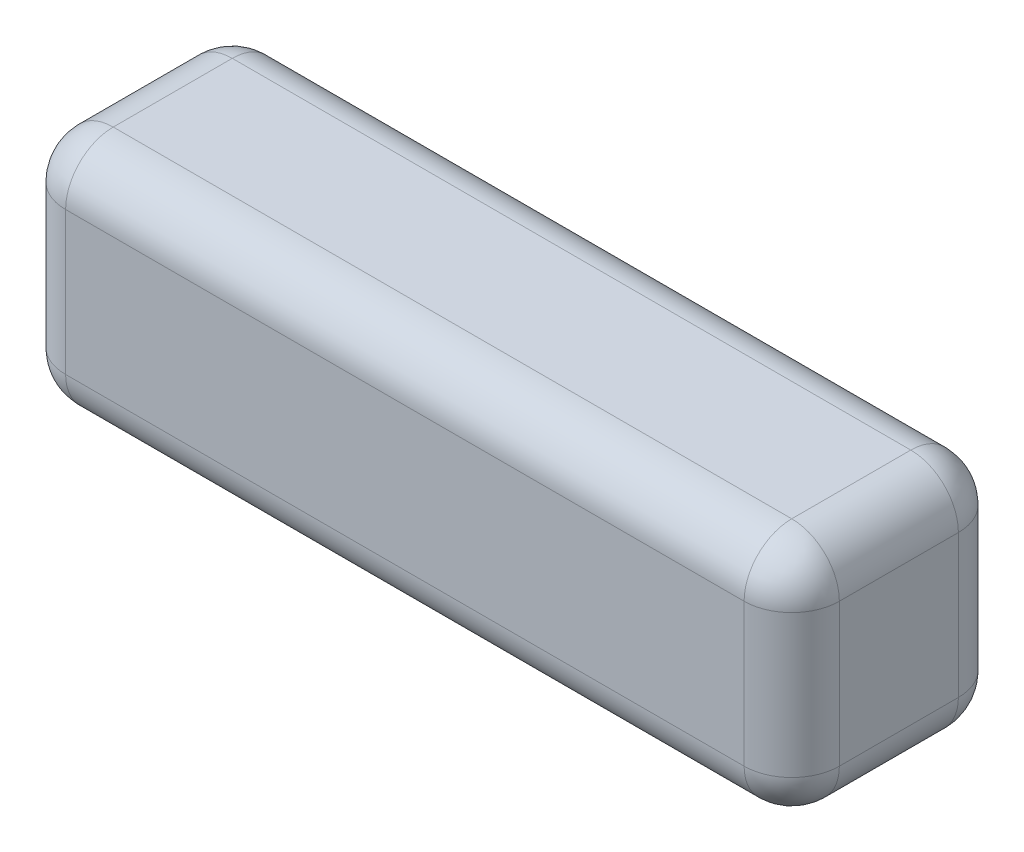
ISO-10303-21;
HEADER;
FILE_DESCRIPTION(('STEP AP214'),'2;1');
FILE_NAME('part.step','',(''),(''),'','','');
FILE_SCHEMA(('AUTOMOTIVE_DESIGN { 1 0 10303 214 1 1 1 1 }'));
ENDSEC;
DATA;
#1=APPLICATION_CONTEXT('core data for automotive mechanical design processes');
#2=APPLICATION_PROTOCOL_DEFINITION('international standard','automotive_design',2000,#1);
#3=PRODUCT_CONTEXT('',#1,'mechanical');
#4=PRODUCT('Part','Part','',(#3));
#5=PRODUCT_RELATED_PRODUCT_CATEGORY('part','',(#4));
#6=PRODUCT_DEFINITION_FORMATION('','',#4);
#7=PRODUCT_DEFINITION_CONTEXT('part definition',#1,'design');
#8=PRODUCT_DEFINITION('design','',#6,#7);
#9=PRODUCT_DEFINITION_SHAPE('','',#8);
#10=(LENGTH_UNIT() NAMED_UNIT(*) SI_UNIT(.MILLI.,.METRE.));
#11=(NAMED_UNIT(*) PLANE_ANGLE_UNIT() SI_UNIT($,.RADIAN.));
#12=(NAMED_UNIT(*) SI_UNIT($,.STERADIAN.) SOLID_ANGLE_UNIT());
#13=UNCERTAINTY_MEASURE_WITH_UNIT(LENGTH_MEASURE(1.E-05),#10,'distance_accuracy_value','');
#14=(GEOMETRIC_REPRESENTATION_CONTEXT(3) GLOBAL_UNCERTAINTY_ASSIGNED_CONTEXT((#13)) GLOBAL_UNIT_ASSIGNED_CONTEXT((#10,
#11,#12)) REPRESENTATION_CONTEXT('',''));
#15=CARTESIAN_POINT('',(0.,0.,0.));
#16=DIRECTION('',(0.,0.,1.));
#17=DIRECTION('',(1.,0.,0.));
#18=AXIS2_PLACEMENT_3D('',#15,#16,#17);
#19=CARTESIAN_POINT('',(28.5,-24.,113.));
#20=DIRECTION('',(0.,-1.,0.));
#21=DIRECTION('',(1.,0.,0.));
#22=AXIS2_PLACEMENT_3D('',#19,#20,#21);
#23=SPHERICAL_SURFACE('',#22,4.);
#24=CARTESIAN_POINT('',(28.5,-24.,113.));
#25=DIRECTION('',(0.,0.,-1.));
#26=DIRECTION('',(1.,0.,0.));
#27=AXIS2_PLACEMENT_3D('',#24,#25,#26);
#28=CIRCLE('',#27,4.);
#29=CARTESIAN_POINT('',(28.5,-20.,113.));
#30=VERTEX_POINT('',#29);
#31=CARTESIAN_POINT('',(32.5,-24.,113.));
#32=VERTEX_POINT('',#31);
#33=EDGE_CURVE('E10',#30,#32,#28,.T.);
#34=ORIENTED_EDGE('',*,*,#33,.F.);
#35=CARTESIAN_POINT('',(28.5,-24.,113.));
#36=DIRECTION('',(1.,0.,0.));
#37=DIRECTION('',(0.,0.,1.));
#38=AXIS2_PLACEMENT_3D('',#35,#36,#37);
#39=CIRCLE('',#38,4.);
#40=CARTESIAN_POINT('',(28.5,-24.,117.));
#41=VERTEX_POINT('',#40);
#42=EDGE_CURVE('E255',#30,#41,#39,.T.);
#43=ORIENTED_EDGE('',*,*,#42,.T.);
#44=CARTESIAN_POINT('',(28.5,-24.,113.));
#45=DIRECTION('',(0.,-1.,0.));
#46=DIRECTION('',(1.,0.,0.));
#47=AXIS2_PLACEMENT_3D('',#44,#45,#46);
#48=CIRCLE('',#47,4.);
#49=EDGE_CURVE('E300',#32,#41,#48,.T.);
#50=ORIENTED_EDGE('',*,*,#49,.F.);
#51=EDGE_LOOP('',(#34,#43,#50));
#52=FACE_BOUND('',#51,.T.);
#53=ADVANCED_FACE('F16',(#52),#23,.T.);
#54=CARTESIAN_POINT('',(28.5,-24.,103.));
#55=DIRECTION('',(0.,0.,1.));
#56=DIRECTION('',(1.,0.,0.));
#57=AXIS2_PLACEMENT_3D('',#54,#55,#56);
#58=SPHERICAL_SURFACE('',#57,4.);
#59=CARTESIAN_POINT('',(28.5,-24.,103.));
#60=DIRECTION('',(0.,-1.,0.));
#61=DIRECTION('',(1.,0.,0.));
#62=AXIS2_PLACEMENT_3D('',#59,#60,#61);
#63=CIRCLE('',#62,4.);
#64=CARTESIAN_POINT('',(28.5,-24.,99.));
#65=VERTEX_POINT('',#64);
#66=CARTESIAN_POINT('',(32.5,-24.,103.));
#67=VERTEX_POINT('',#66);
#68=EDGE_CURVE('E235',#65,#67,#63,.T.);
#69=ORIENTED_EDGE('',*,*,#68,.F.);
#70=CARTESIAN_POINT('',(28.5,-24.,103.));
#71=DIRECTION('',(1.,0.,0.));
#72=DIRECTION('',(0.,1.,0.));
#73=AXIS2_PLACEMENT_3D('',#70,#71,#72);
#74=CIRCLE('',#73,4.);
#75=CARTESIAN_POINT('',(28.5,-20.,103.));
#76=VERTEX_POINT('',#75);
#77=EDGE_CURVE('E236',#65,#76,#74,.T.);
#78=ORIENTED_EDGE('',*,*,#77,.T.);
#79=CARTESIAN_POINT('',(28.5,-24.,103.));
#80=DIRECTION('',(0.,0.,1.));
#81=DIRECTION('',(1.,0.,0.));
#82=AXIS2_PLACEMENT_3D('',#79,#80,#81);
#83=CIRCLE('',#82,4.);
#84=EDGE_CURVE('E25',#67,#76,#83,.T.);
#85=ORIENTED_EDGE('',*,*,#84,.F.);
#86=EDGE_LOOP('',(#69,#78,#85));
#87=FACE_BOUND('',#86,.T.);
#88=ADVANCED_FACE('F385',(#87),#58,.T.);
#89=CARTESIAN_POINT('',(32.5,-40.,99.));
#90=DIRECTION('',(1.,0.,0.));
#91=DIRECTION('',(0.,1.,0.));
#92=AXIS2_PLACEMENT_3D('',#89,#90,#91);
#93=PLANE('',#92);
#94=DIRECTION('',(0.,0.,1.));
#95=VECTOR('',#94,1.);
#96=CARTESIAN_POINT('',(32.5,-36.,99.));
#97=LINE('',#96,#95);
#98=CARTESIAN_POINT('',(32.5,-36.,103.));
#99=VERTEX_POINT('',#98);
#100=CARTESIAN_POINT('',(32.5,-36.,113.));
#101=VERTEX_POINT('',#100);
#102=EDGE_CURVE('E258',#99,#101,#97,.T.);
#103=ORIENTED_EDGE('',*,*,#102,.F.);
#104=DIRECTION('',(0.,1.,0.));
#105=VECTOR('',#104,1.);
#106=CARTESIAN_POINT('',(32.5,-40.,103.));
#107=LINE('',#106,#105);
#108=EDGE_CURVE('E251',#99,#67,#107,.T.);
#109=ORIENTED_EDGE('',*,*,#108,.T.);
#110=DIRECTION('',(0.,0.,1.));
#111=VECTOR('',#110,1.);
#112=CARTESIAN_POINT('',(32.5,-24.,99.));
#113=LINE('',#112,#111);
#114=EDGE_CURVE('E223',#67,#32,#113,.T.);
#115=ORIENTED_EDGE('',*,*,#114,.T.);
#116=DIRECTION('',(0.,1.,0.));
#117=VECTOR('',#116,1.);
#118=CARTESIAN_POINT('',(32.5,-40.,113.));
#119=LINE('',#118,#117);
#120=EDGE_CURVE('E298',#101,#32,#119,.T.);
#121=ORIENTED_EDGE('',*,*,#120,.F.);
#122=EDGE_LOOP('',(#103,#109,#115,#121));
#123=FACE_BOUND('',#122,.T.);
#124=ADVANCED_FACE('F358',(#123),#93,.T.);
#125=CARTESIAN_POINT('',(28.5,-36.,113.));
#126=DIRECTION('',(0.,0.,-1.));
#127=DIRECTION('',(1.,0.,0.));
#128=AXIS2_PLACEMENT_3D('',#125,#126,#127);
#129=SPHERICAL_SURFACE('',#128,4.);
#130=CARTESIAN_POINT('',(28.5,-36.,113.));
#131=DIRECTION('',(0.,1.,0.));
#132=DIRECTION('',(1.,0.,0.));
#133=AXIS2_PLACEMENT_3D('',#130,#131,#132);
#134=CIRCLE('',#133,4.);
#135=CARTESIAN_POINT('',(28.5,-36.,117.));
#136=VERTEX_POINT('',#135);
#137=EDGE_CURVE('E273',#136,#101,#134,.T.);
#138=ORIENTED_EDGE('',*,*,#137,.F.);
#139=CARTESIAN_POINT('',(28.5,-36.,113.));
#140=DIRECTION('',(1.,0.,0.));
#141=DIRECTION('',(0.,-1.,0.));
#142=AXIS2_PLACEMENT_3D('',#139,#140,#141);
#143=CIRCLE('',#142,4.);
#144=CARTESIAN_POINT('',(28.5,-40.,113.));
#145=VERTEX_POINT('',#144);
#146=EDGE_CURVE('E141',#136,#145,#143,.T.);
#147=ORIENTED_EDGE('',*,*,#146,.T.);
#148=CARTESIAN_POINT('',(28.5,-36.,113.));
#149=DIRECTION('',(0.,0.,-1.));
#150=DIRECTION('',(1.,0.,0.));
#151=AXIS2_PLACEMENT_3D('',#148,#149,#150);
#152=CIRCLE('',#151,4.);
#153=EDGE_CURVE('E274',#101,#145,#152,.T.);
#154=ORIENTED_EDGE('',*,*,#153,.F.);
#155=EDGE_LOOP('',(#138,#147,#154));
#156=FACE_BOUND('',#155,.T.);
#157=ADVANCED_FACE('F355',(#156),#129,.T.);
#158=CARTESIAN_POINT('',(28.5,-36.,103.));
#159=DIRECTION('',(0.,0.,1.));
#160=DIRECTION('',(1.,0.,0.));
#161=AXIS2_PLACEMENT_3D('',#158,#159,#160);
#162=SPHERICAL_SURFACE('',#161,4.);
#163=CARTESIAN_POINT('',(28.5,-36.,103.));
#164=DIRECTION('',(0.,0.,-1.));
#165=DIRECTION('',(1.,0.,0.));
#166=AXIS2_PLACEMENT_3D('',#163,#164,#165);
#167=CIRCLE('',#166,4.);
#168=CARTESIAN_POINT('',(28.5,-40.,103.));
#169=VERTEX_POINT('',#168);
#170=EDGE_CURVE('E277',#99,#169,#167,.T.);
#171=ORIENTED_EDGE('',*,*,#170,.T.);
#172=CARTESIAN_POINT('',(28.5,-36.,103.));
#173=DIRECTION('',(-1.,0.,0.));
#174=DIRECTION('',(0.,-1.,0.));
#175=AXIS2_PLACEMENT_3D('',#172,#173,#174);
#176=CIRCLE('',#175,4.);
#177=CARTESIAN_POINT('',(28.5,-36.,99.));
#178=VERTEX_POINT('',#177);
#179=EDGE_CURVE('E281',#178,#169,#176,.T.);
#180=ORIENTED_EDGE('',*,*,#179,.F.);
#181=CARTESIAN_POINT('',(28.5,-36.,103.));
#182=DIRECTION('',(0.,-1.,0.));
#183=DIRECTION('',(1.,0.,0.));
#184=AXIS2_PLACEMENT_3D('',#181,#182,#183);
#185=CIRCLE('',#184,4.);
#186=EDGE_CURVE('E231',#178,#99,#185,.T.);
#187=ORIENTED_EDGE('',*,*,#186,.T.);
#188=EDGE_LOOP('',(#171,#180,#187));
#189=FACE_BOUND('',#188,.T.);
#190=ADVANCED_FACE('F18',(#189),#162,.T.);
#191=CARTESIAN_POINT('',(28.5,-24.,99.));
#192=DIRECTION('',(0.,0.,1.));
#193=DIRECTION('',(1.,0.,0.));
#194=AXIS2_PLACEMENT_3D('',#191,#192,#193);
#195=CYLINDRICAL_SURFACE('',#194,4.);
#196=ORIENTED_EDGE('',*,*,#114,.F.);
#197=ORIENTED_EDGE('',*,*,#84,.T.);
#198=DIRECTION('',(0.,0.,1.));
#199=VECTOR('',#198,1.);
#200=CARTESIAN_POINT('',(28.5,-20.,99.));
#201=LINE('',#200,#199);
#202=EDGE_CURVE('E267',#76,#30,#201,.T.);
#203=ORIENTED_EDGE('',*,*,#202,.T.);
#204=ORIENTED_EDGE('',*,*,#33,.T.);
#205=EDGE_LOOP('',(#196,#197,#203,#204));
#206=FACE_BOUND('',#205,.T.);
#207=ADVANCED_FACE('F417',(#206),#195,.T.);
#208=CARTESIAN_POINT('',(28.5,-40.,113.));
#209=DIRECTION('',(0.,1.,0.));
#210=DIRECTION('',(1.,0.,0.));
#211=AXIS2_PLACEMENT_3D('',#208,#209,#210);
#212=CYLINDRICAL_SURFACE('',#211,4.);
#213=ORIENTED_EDGE('',*,*,#120,.T.);
#214=ORIENTED_EDGE('',*,*,#49,.T.);
#215=DIRECTION('',(0.,1.,0.));
#216=VECTOR('',#215,1.);
#217=CARTESIAN_POINT('',(28.5,-40.,117.));
#218=LINE('',#217,#216);
#219=EDGE_CURVE('E147',#136,#41,#218,.T.);
#220=ORIENTED_EDGE('',*,*,#219,.F.);
#221=ORIENTED_EDGE('',*,*,#137,.T.);
#222=EDGE_LOOP('',(#213,#214,#220,#221));
#223=FACE_BOUND('',#222,.T.);
#224=ADVANCED_FACE('F356',(#223),#212,.T.);
#225=CARTESIAN_POINT('',(-32.5,-24.,113.));
#226=DIRECTION('',(1.,0.,0.));
#227=DIRECTION('',(0.,1.,0.));
#228=AXIS2_PLACEMENT_3D('',#225,#226,#227);
#229=CYLINDRICAL_SURFACE('',#228,4.);
#230=CARTESIAN_POINT('',(-28.5,-24.,113.));
#231=DIRECTION('',(1.,0.,0.));
#232=DIRECTION('',(0.,0.,1.));
#233=AXIS2_PLACEMENT_3D('',#230,#231,#232);
#234=CIRCLE('',#233,4.);
#235=CARTESIAN_POINT('',(-28.5,-20.,113.));
#236=VERTEX_POINT('',#235);
#237=CARTESIAN_POINT('',(-28.5,-24.,117.));
#238=VERTEX_POINT('',#237);
#239=EDGE_CURVE('E227',#236,#238,#234,.T.);
#240=ORIENTED_EDGE('',*,*,#239,.T.);
#241=DIRECTION('',(1.,0.,0.));
#242=VECTOR('',#241,1.);
#243=CARTESIAN_POINT('',(-32.5,-24.,117.));
#244=LINE('',#243,#242);
#245=EDGE_CURVE('E166',#238,#41,#244,.T.);
#246=ORIENTED_EDGE('',*,*,#245,.T.);
#247=ORIENTED_EDGE('',*,*,#42,.F.);
#248=DIRECTION('',(1.,0.,0.));
#249=VECTOR('',#248,1.);
#250=CARTESIAN_POINT('',(-32.5,-20.,113.));
#251=LINE('',#250,#249);
#252=EDGE_CURVE('E263',#236,#30,#251,.T.);
#253=ORIENTED_EDGE('',*,*,#252,.F.);
#254=EDGE_LOOP('',(#240,#246,#247,#253));
#255=FACE_BOUND('',#254,.T.);
#256=ADVANCED_FACE('F362',(#255),#229,.T.);
#257=CARTESIAN_POINT('',(28.5,-40.,103.));
#258=DIRECTION('',(0.,1.,0.));
#259=DIRECTION('',(1.,0.,0.));
#260=AXIS2_PLACEMENT_3D('',#257,#258,#259);
#261=CYLINDRICAL_SURFACE('',#260,4.);
#262=ORIENTED_EDGE('',*,*,#186,.F.);
#263=DIRECTION('',(0.,1.,0.));
#264=VECTOR('',#263,1.);
#265=CARTESIAN_POINT('',(28.5,-40.,99.));
#266=LINE('',#265,#264);
#267=EDGE_CURVE('E243',#178,#65,#266,.T.);
#268=ORIENTED_EDGE('',*,*,#267,.T.);
#269=ORIENTED_EDGE('',*,*,#68,.T.);
#270=ORIENTED_EDGE('',*,*,#108,.F.);
#271=EDGE_LOOP('',(#262,#268,#269,#270));
#272=FACE_BOUND('',#271,.T.);
#273=ADVANCED_FACE('F408',(#272),#261,.T.);
#274=CARTESIAN_POINT('',(-32.5,-24.,103.));
#275=DIRECTION('',(1.,0.,0.));
#276=DIRECTION('',(0.,1.,0.));
#277=AXIS2_PLACEMENT_3D('',#274,#275,#276);
#278=CYLINDRICAL_SURFACE('',#277,4.);
#279=DIRECTION('',(1.,0.,0.));
#280=VECTOR('',#279,1.);
#281=CARTESIAN_POINT('',(-32.5,-20.,103.));
#282=LINE('',#281,#280);
#283=CARTESIAN_POINT('',(-28.5,-20.,103.));
#284=VERTEX_POINT('',#283);
#285=EDGE_CURVE('E270',#284,#76,#282,.T.);
#286=ORIENTED_EDGE('',*,*,#285,.T.);
#287=ORIENTED_EDGE('',*,*,#77,.F.);
#288=DIRECTION('',(1.,0.,0.));
#289=VECTOR('',#288,1.);
#290=CARTESIAN_POINT('',(-32.5,-24.,99.));
#291=LINE('',#290,#289);
#292=CARTESIAN_POINT('',(-28.5,-24.,99.));
#293=VERTEX_POINT('',#292);
#294=EDGE_CURVE('E239',#293,#65,#291,.T.);
#295=ORIENTED_EDGE('',*,*,#294,.F.);
#296=CARTESIAN_POINT('',(-28.5,-24.,103.));
#297=DIRECTION('',(1.,0.,0.));
#298=DIRECTION('',(0.,1.,0.));
#299=AXIS2_PLACEMENT_3D('',#296,#297,#298);
#300=CIRCLE('',#299,4.);
#301=EDGE_CURVE('E148',#293,#284,#300,.T.);
#302=ORIENTED_EDGE('',*,*,#301,.T.);
#303=EDGE_LOOP('',(#286,#287,#295,#302));
#304=FACE_BOUND('',#303,.T.);
#305=ADVANCED_FACE('F403',(#304),#278,.T.);
#306=CARTESIAN_POINT('',(28.5,-36.,99.));
#307=DIRECTION('',(0.,0.,1.));
#308=DIRECTION('',(1.,0.,0.));
#309=AXIS2_PLACEMENT_3D('',#306,#307,#308);
#310=CYLINDRICAL_SURFACE('',#309,4.);
#311=ORIENTED_EDGE('',*,*,#153,.T.);
#312=DIRECTION('',(0.,0.,1.));
#313=VECTOR('',#312,1.);
#314=CARTESIAN_POINT('',(28.5,-40.,99.));
#315=LINE('',#314,#313);
#316=EDGE_CURVE('E199',#169,#145,#315,.T.);
#317=ORIENTED_EDGE('',*,*,#316,.F.);
#318=ORIENTED_EDGE('',*,*,#170,.F.);
#319=ORIENTED_EDGE('',*,*,#102,.T.);
#320=EDGE_LOOP('',(#311,#317,#318,#319));
#321=FACE_BOUND('',#320,.T.);
#322=ADVANCED_FACE('F351',(#321),#310,.T.);
#323=CARTESIAN_POINT('',(-32.5,-36.,113.));
#324=DIRECTION('',(1.,0.,0.));
#325=DIRECTION('',(0.,-1.,0.));
#326=AXIS2_PLACEMENT_3D('',#323,#324,#325);
#327=CYLINDRICAL_SURFACE('',#326,4.);
#328=DIRECTION('',(1.,0.,0.));
#329=VECTOR('',#328,1.);
#330=CARTESIAN_POINT('',(-32.5,-40.,113.));
#331=LINE('',#330,#329);
#332=CARTESIAN_POINT('',(-28.5,-40.,113.));
#333=VERTEX_POINT('',#332);
#334=EDGE_CURVE('E203',#333,#145,#331,.T.);
#335=ORIENTED_EDGE('',*,*,#334,.T.);
#336=ORIENTED_EDGE('',*,*,#146,.F.);
#337=DIRECTION('',(1.,0.,0.));
#338=VECTOR('',#337,1.);
#339=CARTESIAN_POINT('',(-32.5,-36.,117.));
#340=LINE('',#339,#338);
#341=CARTESIAN_POINT('',(-28.5,-36.,117.));
#342=VERTEX_POINT('',#341);
#343=EDGE_CURVE('E134',#342,#136,#340,.T.);
#344=ORIENTED_EDGE('',*,*,#343,.F.);
#345=CARTESIAN_POINT('',(-28.5,-36.,113.));
#346=DIRECTION('',(1.,0.,0.));
#347=DIRECTION('',(0.,-1.,0.));
#348=AXIS2_PLACEMENT_3D('',#345,#346,#347);
#349=CIRCLE('',#348,4.);
#350=EDGE_CURVE('E138',#342,#333,#349,.T.);
#351=ORIENTED_EDGE('',*,*,#350,.T.);
#352=EDGE_LOOP('',(#335,#336,#344,#351));
#353=FACE_BOUND('',#352,.T.);
#354=ADVANCED_FACE('F137',(#353),#327,.T.);
#355=CARTESIAN_POINT('',(-32.5,-36.,103.));
#356=DIRECTION('',(1.,0.,0.));
#357=DIRECTION('',(0.,-1.,0.));
#358=AXIS2_PLACEMENT_3D('',#355,#356,#357);
#359=CYLINDRICAL_SURFACE('',#358,4.);
#360=CARTESIAN_POINT('',(-28.5,-36.,103.));
#361=DIRECTION('',(-1.,0.,0.));
#362=DIRECTION('',(0.,-1.,0.));
#363=AXIS2_PLACEMENT_3D('',#360,#361,#362);
#364=CIRCLE('',#363,4.);
#365=CARTESIAN_POINT('',(-28.5,-36.,99.));
#366=VERTEX_POINT('',#365);
#367=CARTESIAN_POINT('',(-28.5,-40.,103.));
#368=VERTEX_POINT('',#367);
#369=EDGE_CURVE('E159',#366,#368,#364,.T.);
#370=ORIENTED_EDGE('',*,*,#369,.F.);
#371=DIRECTION('',(1.,0.,0.));
#372=VECTOR('',#371,1.);
#373=CARTESIAN_POINT('',(-32.5,-36.,99.));
#374=LINE('',#373,#372);
#375=EDGE_CURVE('E247',#366,#178,#374,.T.);
#376=ORIENTED_EDGE('',*,*,#375,.T.);
#377=ORIENTED_EDGE('',*,*,#179,.T.);
#378=DIRECTION('',(1.,0.,0.));
#379=VECTOR('',#378,1.);
#380=CARTESIAN_POINT('',(-32.5,-40.,103.));
#381=LINE('',#380,#379);
#382=EDGE_CURVE('E158',#368,#169,#381,.T.);
#383=ORIENTED_EDGE('',*,*,#382,.F.);
#384=EDGE_LOOP('',(#370,#376,#377,#383));
#385=FACE_BOUND('',#384,.T.);
#386=ADVANCED_FACE('F429',(#385),#359,.T.);
#387=CARTESIAN_POINT('',(-32.5,-20.,99.));
#388=DIRECTION('',(0.,1.,0.));
#389=DIRECTION('',(1.,0.,0.));
#390=AXIS2_PLACEMENT_3D('',#387,#388,#389);
#391=PLANE('',#390);
#392=DIRECTION('',(0.,0.,1.));
#393=VECTOR('',#392,1.);
#394=CARTESIAN_POINT('',(-28.5,-20.,99.));
#395=LINE('',#394,#393);
#396=EDGE_CURVE('E211',#284,#236,#395,.T.);
#397=ORIENTED_EDGE('',*,*,#396,.T.);
#398=ORIENTED_EDGE('',*,*,#252,.T.);
#399=ORIENTED_EDGE('',*,*,#202,.F.);
#400=ORIENTED_EDGE('',*,*,#285,.F.);
#401=EDGE_LOOP('',(#397,#398,#399,#400));
#402=FACE_BOUND('',#401,.T.);
#403=ADVANCED_FACE('F368',(#402),#391,.T.);
#404=CARTESIAN_POINT('',(-28.5,-24.,113.));
#405=DIRECTION('',(0.,-1.,0.));
#406=DIRECTION('',(-1.,0.,0.));
#407=AXIS2_PLACEMENT_3D('',#404,#405,#406);
#408=SPHERICAL_SURFACE('',#407,4.);
#409=CARTESIAN_POINT('',(-28.5,-24.,113.));
#410=DIRECTION('',(0.,1.,0.));
#411=DIRECTION('',(-1.,0.,0.));
#412=AXIS2_PLACEMENT_3D('',#409,#410,#411);
#413=CIRCLE('',#412,4.);
#414=CARTESIAN_POINT('',(-32.5,-24.,113.));
#415=VERTEX_POINT('',#414);
#416=EDGE_CURVE('E171',#415,#238,#413,.T.);
#417=ORIENTED_EDGE('',*,*,#416,.T.);
#418=ORIENTED_EDGE('',*,*,#239,.F.);
#419=CARTESIAN_POINT('',(-28.5,-24.,113.));
#420=DIRECTION('',(0.,0.,1.));
#421=DIRECTION('',(-1.,0.,0.));
#422=AXIS2_PLACEMENT_3D('',#419,#420,#421);
#423=CIRCLE('',#422,4.);
#424=EDGE_CURVE('E206',#236,#415,#423,.T.);
#425=ORIENTED_EDGE('',*,*,#424,.T.);
#426=EDGE_LOOP('',(#417,#418,#425));
#427=FACE_BOUND('',#426,.T.);
#428=ADVANCED_FACE('F365',(#427),#408,.T.);
#429=CARTESIAN_POINT('',(-32.5,-40.,117.));
#430=DIRECTION('',(0.,0.,1.));
#431=DIRECTION('',(1.,0.,0.));
#432=AXIS2_PLACEMENT_3D('',#429,#430,#431);
#433=PLANE('',#432);
#434=DIRECTION('',(0.,1.,0.));
#435=VECTOR('',#434,1.);
#436=CARTESIAN_POINT('',(-28.5,-40.,117.));
#437=LINE('',#436,#435);
#438=EDGE_CURVE('E163',#342,#238,#437,.T.);
#439=ORIENTED_EDGE('',*,*,#438,.F.);
#440=ORIENTED_EDGE('',*,*,#343,.T.);
#441=ORIENTED_EDGE('',*,*,#219,.T.);
#442=ORIENTED_EDGE('',*,*,#245,.F.);
#443=EDGE_LOOP('',(#439,#440,#441,#442));
#444=FACE_BOUND('',#443,.T.);
#445=ADVANCED_FACE('F164',(#444),#433,.T.);
#446=CARTESIAN_POINT('',(-28.5,-24.,103.));
#447=DIRECTION('',(0.,0.,1.));
#448=DIRECTION('',(-1.,0.,0.));
#449=AXIS2_PLACEMENT_3D('',#446,#447,#448);
#450=SPHERICAL_SURFACE('',#449,4.);
#451=CARTESIAN_POINT('',(-28.5,-24.,103.));
#452=DIRECTION('',(0.,0.,-1.));
#453=DIRECTION('',(-1.,0.,0.));
#454=AXIS2_PLACEMENT_3D('',#451,#452,#453);
#455=CIRCLE('',#454,4.);
#456=CARTESIAN_POINT('',(-32.5,-24.,103.));
#457=VERTEX_POINT('',#456);
#458=EDGE_CURVE('E215',#457,#284,#455,.T.);
#459=ORIENTED_EDGE('',*,*,#458,.T.);
#460=ORIENTED_EDGE('',*,*,#301,.F.);
#461=CARTESIAN_POINT('',(-28.5,-24.,103.));
#462=DIRECTION('',(0.,1.,0.));
#463=DIRECTION('',(-1.,0.,0.));
#464=AXIS2_PLACEMENT_3D('',#461,#462,#463);
#465=CIRCLE('',#464,4.);
#466=EDGE_CURVE('E190',#293,#457,#465,.T.);
#467=ORIENTED_EDGE('',*,*,#466,.T.);
#468=EDGE_LOOP('',(#459,#460,#467));
#469=FACE_BOUND('',#468,.T.);
#470=ADVANCED_FACE('F399',(#469),#450,.T.);
#471=CARTESIAN_POINT('',(-32.5,-40.,99.));
#472=DIRECTION('',(0.,0.,1.));
#473=DIRECTION('',(1.,0.,0.));
#474=AXIS2_PLACEMENT_3D('',#471,#472,#473);
#475=PLANE('',#474);
#476=ORIENTED_EDGE('',*,*,#294,.T.);
#477=ORIENTED_EDGE('',*,*,#267,.F.);
#478=ORIENTED_EDGE('',*,*,#375,.F.);
#479=DIRECTION('',(0.,1.,0.));
#480=VECTOR('',#479,1.);
#481=CARTESIAN_POINT('',(-28.5,-40.,99.));
#482=LINE('',#481,#480);
#483=EDGE_CURVE('E184',#366,#293,#482,.T.);
#484=ORIENTED_EDGE('',*,*,#483,.T.);
#485=EDGE_LOOP('',(#476,#477,#478,#484));
#486=FACE_BOUND('',#485,.T.);
#487=ADVANCED_FACE('F396',(#486),#475,.F.);
#488=CARTESIAN_POINT('',(-32.5,-40.,99.));
#489=DIRECTION('',(0.,1.,0.));
#490=DIRECTION('',(1.,0.,0.));
#491=AXIS2_PLACEMENT_3D('',#488,#489,#490);
#492=PLANE('',#491);
#493=ORIENTED_EDGE('',*,*,#382,.T.);
#494=ORIENTED_EDGE('',*,*,#316,.T.);
#495=ORIENTED_EDGE('',*,*,#334,.F.);
#496=DIRECTION('',(0.,0.,1.));
#497=VECTOR('',#496,1.);
#498=CARTESIAN_POINT('',(-28.5,-40.,99.));
#499=LINE('',#498,#497);
#500=EDGE_CURVE('E198',#368,#333,#499,.T.);
#501=ORIENTED_EDGE('',*,*,#500,.F.);
#502=EDGE_LOOP('',(#493,#494,#495,#501));
#503=FACE_BOUND('',#502,.T.);
#504=ADVANCED_FACE('F347',(#503),#492,.F.);
#505=CARTESIAN_POINT('',(-28.5,-36.,113.));
#506=DIRECTION('',(0.,0.,-1.));
#507=DIRECTION('',(-1.,0.,0.));
#508=AXIS2_PLACEMENT_3D('',#505,#506,#507);
#509=SPHERICAL_SURFACE('',#508,4.);
#510=CARTESIAN_POINT('',(-28.5,-36.,113.));
#511=DIRECTION('',(0.,0.,1.));
#512=DIRECTION('',(-1.,0.,0.));
#513=AXIS2_PLACEMENT_3D('',#510,#511,#512);
#514=CIRCLE('',#513,4.);
#515=CARTESIAN_POINT('',(-32.5,-36.,113.));
#516=VERTEX_POINT('',#515);
#517=EDGE_CURVE('E155',#516,#333,#514,.T.);
#518=ORIENTED_EDGE('',*,*,#517,.T.);
#519=ORIENTED_EDGE('',*,*,#350,.F.);
#520=CARTESIAN_POINT('',(-28.5,-36.,113.));
#521=DIRECTION('',(0.,-1.,0.));
#522=DIRECTION('',(-1.,0.,0.));
#523=AXIS2_PLACEMENT_3D('',#520,#521,#522);
#524=CIRCLE('',#523,4.);
#525=EDGE_CURVE('E153',#342,#516,#524,.T.);
#526=ORIENTED_EDGE('',*,*,#525,.T.);
#527=EDGE_LOOP('',(#518,#519,#526));
#528=FACE_BOUND('',#527,.T.);
#529=ADVANCED_FACE('F151',(#528),#509,.T.);
#530=CARTESIAN_POINT('',(-28.5,-36.,103.));
#531=DIRECTION('',(0.,0.,1.));
#532=DIRECTION('',(-1.,0.,0.));
#533=AXIS2_PLACEMENT_3D('',#530,#531,#532);
#534=SPHERICAL_SURFACE('',#533,4.);
#535=CARTESIAN_POINT('',(-28.5,-36.,103.));
#536=DIRECTION('',(0.,1.,0.));
#537=DIRECTION('',(-1.,0.,0.));
#538=AXIS2_PLACEMENT_3D('',#535,#536,#537);
#539=CIRCLE('',#538,4.);
#540=CARTESIAN_POINT('',(-32.5,-36.,103.));
#541=VERTEX_POINT('',#540);
#542=EDGE_CURVE('E178',#366,#541,#539,.T.);
#543=ORIENTED_EDGE('',*,*,#542,.F.);
#544=ORIENTED_EDGE('',*,*,#369,.T.);
#545=CARTESIAN_POINT('',(-28.5,-36.,103.));
#546=DIRECTION('',(0.,0.,1.));
#547=DIRECTION('',(-1.,0.,0.));
#548=AXIS2_PLACEMENT_3D('',#545,#546,#547);
#549=CIRCLE('',#548,4.);
#550=EDGE_CURVE('E194',#541,#368,#549,.T.);
#551=ORIENTED_EDGE('',*,*,#550,.F.);
#552=EDGE_LOOP('',(#543,#544,#551));
#553=FACE_BOUND('',#552,.T.);
#554=ADVANCED_FACE('F372',(#553),#534,.T.);
#555=CARTESIAN_POINT('',(-28.5,-24.,99.));
#556=DIRECTION('',(0.,0.,1.));
#557=DIRECTION('',(-1.,0.,0.));
#558=AXIS2_PLACEMENT_3D('',#555,#556,#557);
#559=CYLINDRICAL_SURFACE('',#558,4.);
#560=ORIENTED_EDGE('',*,*,#424,.F.);
#561=ORIENTED_EDGE('',*,*,#396,.F.);
#562=ORIENTED_EDGE('',*,*,#458,.F.);
#563=DIRECTION('',(0.,0.,1.));
#564=VECTOR('',#563,1.);
#565=CARTESIAN_POINT('',(-32.5,-24.,99.));
#566=LINE('',#565,#564);
#567=EDGE_CURVE('E320',#457,#415,#566,.T.);
#568=ORIENTED_EDGE('',*,*,#567,.T.);
#569=EDGE_LOOP('',(#560,#561,#562,#568));
#570=FACE_BOUND('',#569,.T.);
#571=ADVANCED_FACE('F370',(#570),#559,.T.);
#572=CARTESIAN_POINT('',(-28.5,-40.,113.));
#573=DIRECTION('',(0.,1.,0.));
#574=DIRECTION('',(-1.,0.,0.));
#575=AXIS2_PLACEMENT_3D('',#572,#573,#574);
#576=CYLINDRICAL_SURFACE('',#575,4.);
#577=ORIENTED_EDGE('',*,*,#525,.F.);
#578=ORIENTED_EDGE('',*,*,#438,.T.);
#579=ORIENTED_EDGE('',*,*,#416,.F.);
#580=DIRECTION('',(0.,1.,0.));
#581=VECTOR('',#580,1.);
#582=CARTESIAN_POINT('',(-32.5,-40.,113.));
#583=LINE('',#582,#581);
#584=EDGE_CURVE('E176',#516,#415,#583,.T.);
#585=ORIENTED_EDGE('',*,*,#584,.F.);
#586=EDGE_LOOP('',(#577,#578,#579,#585));
#587=FACE_BOUND('',#586,.T.);
#588=ADVANCED_FACE('F174',(#587),#576,.T.);
#589=CARTESIAN_POINT('',(-28.5,-40.,103.));
#590=DIRECTION('',(0.,1.,0.));
#591=DIRECTION('',(-1.,0.,0.));
#592=AXIS2_PLACEMENT_3D('',#589,#590,#591);
#593=CYLINDRICAL_SURFACE('',#592,4.);
#594=DIRECTION('',(0.,1.,0.));
#595=VECTOR('',#594,1.);
#596=CARTESIAN_POINT('',(-32.5,-40.,103.));
#597=LINE('',#596,#595);
#598=EDGE_CURVE('E317',#541,#457,#597,.T.);
#599=ORIENTED_EDGE('',*,*,#598,.T.);
#600=ORIENTED_EDGE('',*,*,#466,.F.);
#601=ORIENTED_EDGE('',*,*,#483,.F.);
#602=ORIENTED_EDGE('',*,*,#542,.T.);
#603=EDGE_LOOP('',(#599,#600,#601,#602));
#604=FACE_BOUND('',#603,.T.);
#605=ADVANCED_FACE('F379',(#604),#593,.T.);
#606=CARTESIAN_POINT('',(-28.5,-36.,99.));
#607=DIRECTION('',(0.,0.,1.));
#608=DIRECTION('',(-1.,0.,0.));
#609=AXIS2_PLACEMENT_3D('',#606,#607,#608);
#610=CYLINDRICAL_SURFACE('',#609,4.);
#611=DIRECTION('',(0.,0.,1.));
#612=VECTOR('',#611,1.);
#613=CARTESIAN_POINT('',(-32.5,-36.,99.));
#614=LINE('',#613,#612);
#615=EDGE_CURVE('E188',#541,#516,#614,.T.);
#616=ORIENTED_EDGE('',*,*,#615,.F.);
#617=ORIENTED_EDGE('',*,*,#550,.T.);
#618=ORIENTED_EDGE('',*,*,#500,.T.);
#619=ORIENTED_EDGE('',*,*,#517,.F.);
#620=EDGE_LOOP('',(#616,#617,#618,#619));
#621=FACE_BOUND('',#620,.T.);
#622=ADVANCED_FACE('F344',(#621),#610,.T.);
#623=CARTESIAN_POINT('',(-32.5,-40.,99.));
#624=DIRECTION('',(1.,0.,0.));
#625=DIRECTION('',(0.,1.,0.));
#626=AXIS2_PLACEMENT_3D('',#623,#624,#625);
#627=PLANE('',#626);
#628=ORIENTED_EDGE('',*,*,#584,.T.);
#629=ORIENTED_EDGE('',*,*,#567,.F.);
#630=ORIENTED_EDGE('',*,*,#598,.F.);
#631=ORIENTED_EDGE('',*,*,#615,.T.);
#632=EDGE_LOOP('',(#628,#629,#630,#631));
#633=FACE_BOUND('',#632,.T.);
#634=ADVANCED_FACE('F556',(#633),#627,.F.);
#635=CLOSED_SHELL('',(#53,#88,#124,#157,#190,#207,#224,#256,#273,#305,#322,#354,#386,#403,#428,
#445,#470,#487,#504,#529,#554,#571,#588,#605,#622,#634));
#636=MANIFOLD_SOLID_BREP('B1',#635);
#637=ADVANCED_BREP_SHAPE_REPRESENTATION('',(#18,#636),#14);
#638=SHAPE_DEFINITION_REPRESENTATION(#9,#637);
ENDSEC;
END-ISO-10303-21;
